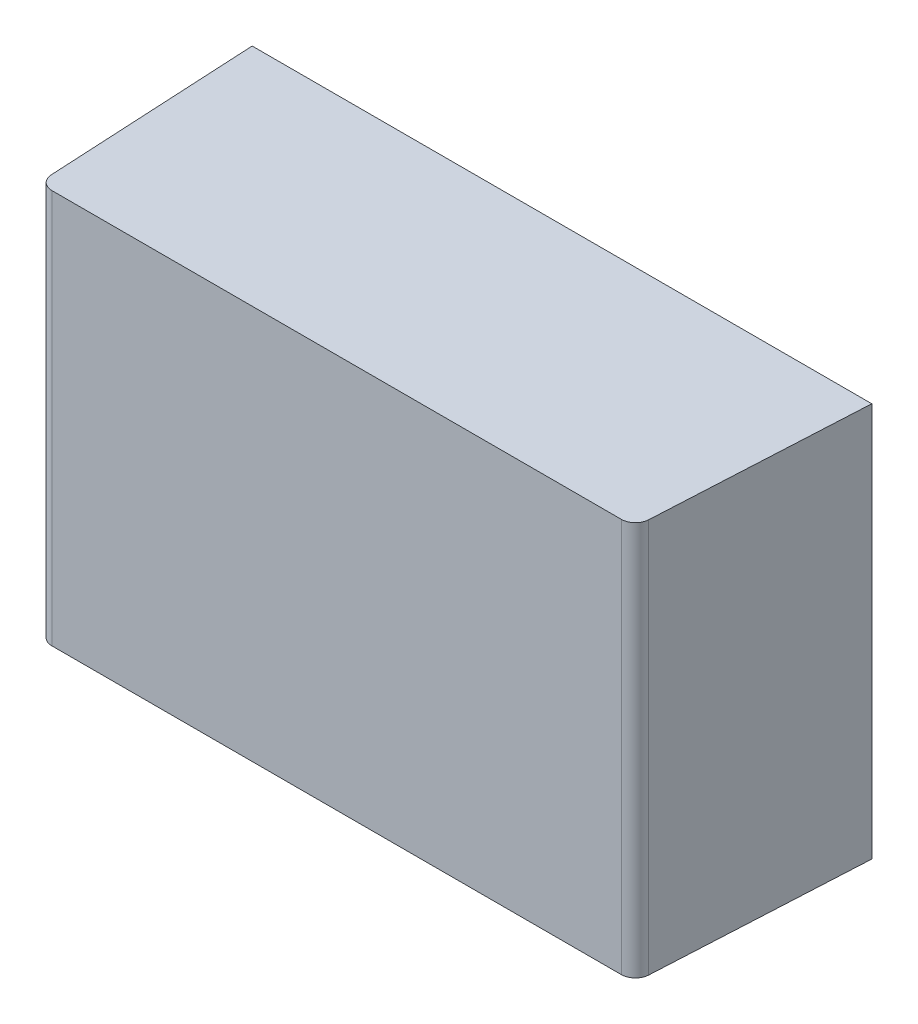
ISO-10303-21;
HEADER;
FILE_DESCRIPTION(('STEP AP214'),'2;1');
FILE_NAME('part.step','',(''),(''),'','','');
FILE_SCHEMA(('AUTOMOTIVE_DESIGN { 1 0 10303 214 1 1 1 1 }'));
ENDSEC;
DATA;
#1=APPLICATION_CONTEXT('core data for automotive mechanical design processes');
#2=APPLICATION_PROTOCOL_DEFINITION('international standard','automotive_design',2000,#1);
#3=PRODUCT_CONTEXT('',#1,'mechanical');
#4=PRODUCT('Part','Part','',(#3));
#5=PRODUCT_RELATED_PRODUCT_CATEGORY('part','',(#4));
#6=PRODUCT_DEFINITION_FORMATION('','',#4);
#7=PRODUCT_DEFINITION_CONTEXT('part definition',#1,'design');
#8=PRODUCT_DEFINITION('design','',#6,#7);
#9=PRODUCT_DEFINITION_SHAPE('','',#8);
#10=(LENGTH_UNIT() NAMED_UNIT(*) SI_UNIT(.MILLI.,.METRE.));
#11=(NAMED_UNIT(*) PLANE_ANGLE_UNIT() SI_UNIT($,.RADIAN.));
#12=(NAMED_UNIT(*) SI_UNIT($,.STERADIAN.) SOLID_ANGLE_UNIT());
#13=UNCERTAINTY_MEASURE_WITH_UNIT(LENGTH_MEASURE(1.E-05),#10,'distance_accuracy_value','');
#14=(GEOMETRIC_REPRESENTATION_CONTEXT(3) GLOBAL_UNCERTAINTY_ASSIGNED_CONTEXT((#13)) GLOBAL_UNIT_ASSIGNED_CONTEXT((#10,
#11,#12)) REPRESENTATION_CONTEXT('',''));
#15=CARTESIAN_POINT('',(0.,0.,0.));
#16=DIRECTION('',(0.,0.,1.));
#17=DIRECTION('',(1.,0.,0.));
#18=AXIS2_PLACEMENT_3D('',#15,#16,#17);
#19=CARTESIAN_POINT('',(-0.505312774119,0.175,0.675));
#20=DIRECTION('',(0.,-1.,0.));
#21=DIRECTION('',(-0.688354575694027,0.,0.725374371012028));
#22=AXIS2_PLACEMENT_3D('',#19,#20,#21);
#23=CYLINDRICAL_SURFACE('',#22,0.025);
#24=CARTESIAN_POINT('',(-0.505312774119,-0.35,0.675));
#25=DIRECTION('',(0.,1.,0.));
#26=DIRECTION('',(-0.688354575694027,0.,0.725374371012028));
#27=AXIS2_PLACEMENT_3D('',#24,#25,#26);
#28=CIRCLE('',#27,0.025);
#29=CARTESIAN_POINT('',(-0.530278512488,-0.35,0.676308398906));
#30=VERTEX_POINT('',#29);
#31=CARTESIAN_POINT('',(-0.505312774119,-0.35,0.7));
#32=VERTEX_POINT('',#31);
#33=EDGE_CURVE('E180',#30,#32,#28,.T.);
#34=ORIENTED_EDGE('',*,*,#33,.T.);
#35=DIRECTION('',(0.,1.,0.));
#36=VECTOR('',#35,1.);
#37=CARTESIAN_POINT('',(-0.505312774119,0.175,0.7));
#38=LINE('',#37,#36);
#39=CARTESIAN_POINT('',(-0.505312774119,0.35,0.7));
#40=VERTEX_POINT('',#39);
#41=EDGE_CURVE('E170',#32,#40,#38,.T.);
#42=ORIENTED_EDGE('',*,*,#41,.T.);
#43=CARTESIAN_POINT('',(-0.505312774119,0.35,0.675));
#44=DIRECTION('',(0.,-1.,0.));
#45=DIRECTION('',(-0.688354575694027,0.,0.725374371012028));
#46=AXIS2_PLACEMENT_3D('',#43,#44,#45);
#47=CIRCLE('',#46,0.025);
#48=CARTESIAN_POINT('',(-0.530278512488,0.35,0.676308398906));
#49=VERTEX_POINT('',#48);
#50=EDGE_CURVE('E11',#40,#49,#47,.T.);
#51=ORIENTED_EDGE('',*,*,#50,.T.);
#52=DIRECTION('',(0.,-1.,0.));
#53=VECTOR('',#52,1.);
#54=CARTESIAN_POINT('',(-0.530278512488,0.175,0.676308398906));
#55=LINE('',#54,#53);
#56=EDGE_CURVE('E140',#49,#30,#55,.T.);
#57=ORIENTED_EDGE('',*,*,#56,.T.);
#58=EDGE_LOOP('',(#34,#42,#51,#57));
#59=FACE_BOUND('',#58,.T.);
#60=ADVANCED_FACE('F17',(#59),#23,.T.);
#61=CARTESIAN_POINT('',(0.55,0.35,0.3));
#62=DIRECTION('',(0.,1.,0.));
#63=DIRECTION('',(1.,0.,0.));
#64=AXIS2_PLACEMENT_3D('',#61,#62,#63);
#65=PLANE('',#64);
#66=ORIENTED_EDGE('',*,*,#50,.F.);
#67=DIRECTION('',(-1.,0.,0.));
#68=VECTOR('',#67,1.);
#69=CARTESIAN_POINT('',(-0.55,0.35,0.7));
#70=LINE('',#69,#68);
#71=CARTESIAN_POINT('',(0.505312774119,0.35,0.7));
#72=VERTEX_POINT('',#71);
#73=EDGE_CURVE('E28',#72,#40,#70,.T.);
#74=ORIENTED_EDGE('',*,*,#73,.F.);
#75=CARTESIAN_POINT('',(0.505312774119,0.35,0.675));
#76=DIRECTION('',(0.,-1.,0.));
#77=DIRECTION('',(0.688354575694027,0.,0.725374371012028));
#78=AXIS2_PLACEMENT_3D('',#75,#76,#77);
#79=CIRCLE('',#78,0.025);
#80=CARTESIAN_POINT('',(0.530278512488,0.35,0.676308398906));
#81=VERTEX_POINT('',#80);
#82=EDGE_CURVE('E172',#81,#72,#79,.T.);
#83=ORIENTED_EDGE('',*,*,#82,.F.);
#84=DIRECTION('',(-0.0523359562429177,0.,0.998629534754575));
#85=VECTOR('',#84,1.);
#86=CARTESIAN_POINT('',(0.55,0.35,0.3));
#87=LINE('',#86,#85);
#88=CARTESIAN_POINT('',(0.55,0.35,0.3));
#89=VERTEX_POINT('',#88);
#90=EDGE_CURVE('E149',#89,#81,#87,.T.);
#91=ORIENTED_EDGE('',*,*,#90,.F.);
#92=DIRECTION('',(-1.,0.,0.));
#93=VECTOR('',#92,1.);
#94=CARTESIAN_POINT('',(-0.55,0.35,0.3));
#95=LINE('',#94,#93);
#96=CARTESIAN_POINT('',(-0.55,0.35,0.3));
#97=VERTEX_POINT('',#96);
#98=EDGE_CURVE('E145',#89,#97,#95,.T.);
#99=ORIENTED_EDGE('',*,*,#98,.T.);
#100=DIRECTION('',(0.0523359562429177,0.,0.998629534754575));
#101=VECTOR('',#100,1.);
#102=CARTESIAN_POINT('',(-0.548493521226,0.35,0.328745327399));
#103=LINE('',#102,#101);
#104=EDGE_CURVE('E133',#97,#49,#103,.T.);
#105=ORIENTED_EDGE('',*,*,#104,.T.);
#106=EDGE_LOOP('',(#66,#74,#83,#91,#99,#105));
#107=FACE_BOUND('',#106,.T.);
#108=ADVANCED_FACE('F146',(#107),#65,.T.);
#109=CARTESIAN_POINT('',(0.,0.,0.7));
#110=DIRECTION('',(0.,0.,1.));
#111=DIRECTION('',(1.,0.,0.));
#112=AXIS2_PLACEMENT_3D('',#109,#110,#111);
#113=PLANE('',#112);
#114=ORIENTED_EDGE('',*,*,#41,.F.);
#115=DIRECTION('',(1.,0.,0.));
#116=VECTOR('',#115,1.);
#117=CARTESIAN_POINT('',(0.55,-0.35,0.7));
#118=LINE('',#117,#116);
#119=CARTESIAN_POINT('',(0.505312774119,-0.35,0.7));
#120=VERTEX_POINT('',#119);
#121=EDGE_CURVE('E216',#32,#120,#118,.T.);
#122=ORIENTED_EDGE('',*,*,#121,.T.);
#123=DIRECTION('',(0.,-1.,0.));
#124=VECTOR('',#123,1.);
#125=CARTESIAN_POINT('',(0.505312774119,-0.175,0.7));
#126=LINE('',#125,#124);
#127=EDGE_CURVE('E176',#72,#120,#126,.T.);
#128=ORIENTED_EDGE('',*,*,#127,.F.);
#129=ORIENTED_EDGE('',*,*,#73,.T.);
#130=EDGE_LOOP('',(#114,#122,#128,#129));
#131=FACE_BOUND('',#130,.T.);
#132=ADVANCED_FACE('F280',(#131),#113,.T.);
#133=CARTESIAN_POINT('',(0.505312774119,-0.175,0.675));
#134=DIRECTION('',(0.,1.,0.));
#135=DIRECTION('',(0.688354575694027,0.,0.725374371012028));
#136=AXIS2_PLACEMENT_3D('',#133,#134,#135);
#137=CYLINDRICAL_SURFACE('',#136,0.025);
#138=ORIENTED_EDGE('',*,*,#82,.T.);
#139=ORIENTED_EDGE('',*,*,#127,.T.);
#140=CARTESIAN_POINT('',(0.505312774119,-0.35,0.675));
#141=DIRECTION('',(0.,1.,0.));
#142=DIRECTION('',(0.688354575694027,0.,0.725374371012028));
#143=AXIS2_PLACEMENT_3D('',#140,#141,#142);
#144=CIRCLE('',#143,0.025);
#145=CARTESIAN_POINT('',(0.530278512488,-0.35,0.676308398906));
#146=VERTEX_POINT('',#145);
#147=EDGE_CURVE('E223',#120,#146,#144,.T.);
#148=ORIENTED_EDGE('',*,*,#147,.T.);
#149=DIRECTION('',(0.,1.,0.));
#150=VECTOR('',#149,1.);
#151=CARTESIAN_POINT('',(0.530278512488,-0.175,0.676308398906));
#152=LINE('',#151,#150);
#153=EDGE_CURVE('E212',#146,#81,#152,.T.);
#154=ORIENTED_EDGE('',*,*,#153,.T.);
#155=EDGE_LOOP('',(#138,#139,#148,#154));
#156=FACE_BOUND('',#155,.T.);
#157=ADVANCED_FACE('F293',(#156),#137,.T.);
#158=CARTESIAN_POINT('',(-0.39,0.35,0.3));
#159=DIRECTION('',(-1.,0.,0.));
#160=DIRECTION('',(0.,0.,1.));
#161=AXIS2_PLACEMENT_3D('',#158,#159,#160);
#162=PLANE('',#161);
#163=DIRECTION('',(0.,-1.,0.));
#164=VECTOR('',#163,1.);
#165=CARTESIAN_POINT('',(-0.39,0.175,0.3));
#166=LINE('',#165,#164);
#167=CARTESIAN_POINT('',(-0.39,0.19,0.3));
#168=VERTEX_POINT('',#167);
#169=CARTESIAN_POINT('',(-0.39,-0.19,0.3));
#170=VERTEX_POINT('',#169);
#171=EDGE_CURVE('E245',#168,#170,#166,.T.);
#172=ORIENTED_EDGE('',*,*,#171,.F.);
#173=DIRECTION('',(0.,0.,1.));
#174=VECTOR('',#173,1.);
#175=CARTESIAN_POINT('',(-0.39,0.19,0.3));
#176=LINE('',#175,#174);
#177=CARTESIAN_POINT('',(-0.39,0.19,0.54));
#178=VERTEX_POINT('',#177);
#179=EDGE_CURVE('E74',#168,#178,#176,.T.);
#180=ORIENTED_EDGE('',*,*,#179,.T.);
#181=DIRECTION('',(0.,-1.,0.));
#182=VECTOR('',#181,1.);
#183=CARTESIAN_POINT('',(-0.39,0.175,0.54));
#184=LINE('',#183,#182);
#185=CARTESIAN_POINT('',(-0.39,-0.19,0.54));
#186=VERTEX_POINT('',#185);
#187=EDGE_CURVE('E198',#178,#186,#184,.T.);
#188=ORIENTED_EDGE('',*,*,#187,.T.);
#189=DIRECTION('',(0.,0.,1.));
#190=VECTOR('',#189,1.);
#191=CARTESIAN_POINT('',(-0.39,-0.19,0.3));
#192=LINE('',#191,#190);
#193=EDGE_CURVE('E58',#170,#186,#192,.T.);
#194=ORIENTED_EDGE('',*,*,#193,.F.);
#195=EDGE_LOOP('',(#172,#180,#188,#194));
#196=FACE_BOUND('',#195,.T.);
#197=ADVANCED_FACE('F259',(#196),#162,.F.);
#198=CARTESIAN_POINT('',(0.55,0.19,0.3));
#199=DIRECTION('',(0.,1.,0.));
#200=DIRECTION('',(1.,0.,0.));
#201=AXIS2_PLACEMENT_3D('',#198,#199,#200);
#202=PLANE('',#201);
#203=DIRECTION('',(-1.,0.,0.));
#204=VECTOR('',#203,1.);
#205=CARTESIAN_POINT('',(0.275,0.19,0.3));
#206=LINE('',#205,#204);
#207=CARTESIAN_POINT('',(0.39,0.19,0.3));
#208=VERTEX_POINT('',#207);
#209=EDGE_CURVE('E166',#208,#168,#206,.T.);
#210=ORIENTED_EDGE('',*,*,#209,.F.);
#211=DIRECTION('',(0.,0.,1.));
#212=VECTOR('',#211,1.);
#213=CARTESIAN_POINT('',(0.39,0.19,0.3));
#214=LINE('',#213,#212);
#215=CARTESIAN_POINT('',(0.39,0.19,0.54));
#216=VERTEX_POINT('',#215);
#217=EDGE_CURVE('E21',#208,#216,#214,.T.);
#218=ORIENTED_EDGE('',*,*,#217,.T.);
#219=DIRECTION('',(-1.,0.,0.));
#220=VECTOR('',#219,1.);
#221=CARTESIAN_POINT('',(0.275,0.19,0.54));
#222=LINE('',#221,#220);
#223=EDGE_CURVE('E203',#216,#178,#222,.T.);
#224=ORIENTED_EDGE('',*,*,#223,.T.);
#225=ORIENTED_EDGE('',*,*,#179,.F.);
#226=EDGE_LOOP('',(#210,#218,#224,#225));
#227=FACE_BOUND('',#226,.T.);
#228=ADVANCED_FACE('F258',(#227),#202,.F.);
#229=CARTESIAN_POINT('',(0.39,-0.35,0.3));
#230=DIRECTION('',(1.,0.,0.));
#231=DIRECTION('',(0.,1.,0.));
#232=AXIS2_PLACEMENT_3D('',#229,#230,#231);
#233=PLANE('',#232);
#234=DIRECTION('',(0.,1.,0.));
#235=VECTOR('',#234,1.);
#236=CARTESIAN_POINT('',(0.39,-0.175,0.3));
#237=LINE('',#236,#235);
#238=CARTESIAN_POINT('',(0.39,-0.19,0.3));
#239=VERTEX_POINT('',#238);
#240=EDGE_CURVE('E229',#239,#208,#237,.T.);
#241=ORIENTED_EDGE('',*,*,#240,.F.);
#242=DIRECTION('',(0.,0.,1.));
#243=VECTOR('',#242,1.);
#244=CARTESIAN_POINT('',(0.39,-0.19,0.3));
#245=LINE('',#244,#243);
#246=CARTESIAN_POINT('',(0.39,-0.19,0.54));
#247=VERTEX_POINT('',#246);
#248=EDGE_CURVE('E111',#239,#247,#245,.T.);
#249=ORIENTED_EDGE('',*,*,#248,.T.);
#250=DIRECTION('',(0.,1.,0.));
#251=VECTOR('',#250,1.);
#252=CARTESIAN_POINT('',(0.39,-0.175,0.54));
#253=LINE('',#252,#251);
#254=EDGE_CURVE('E178',#247,#216,#253,.T.);
#255=ORIENTED_EDGE('',*,*,#254,.T.);
#256=ORIENTED_EDGE('',*,*,#217,.F.);
#257=EDGE_LOOP('',(#241,#249,#255,#256));
#258=FACE_BOUND('',#257,.T.);
#259=ADVANCED_FACE('F255',(#258),#233,.F.);
#260=CARTESIAN_POINT('',(-0.55,-0.19,0.3));
#261=DIRECTION('',(0.,-1.,0.));
#262=DIRECTION('',(0.,0.,-1.));
#263=AXIS2_PLACEMENT_3D('',#260,#261,#262);
#264=PLANE('',#263);
#265=DIRECTION('',(1.,0.,0.));
#266=VECTOR('',#265,1.);
#267=CARTESIAN_POINT('',(-0.275,-0.19,0.3));
#268=LINE('',#267,#266);
#269=EDGE_CURVE('E232',#170,#239,#268,.T.);
#270=ORIENTED_EDGE('',*,*,#269,.F.);
#271=ORIENTED_EDGE('',*,*,#193,.T.);
#272=DIRECTION('',(1.,0.,0.));
#273=VECTOR('',#272,1.);
#274=CARTESIAN_POINT('',(-0.275,-0.19,0.54));
#275=LINE('',#274,#273);
#276=EDGE_CURVE('E142',#186,#247,#275,.T.);
#277=ORIENTED_EDGE('',*,*,#276,.T.);
#278=ORIENTED_EDGE('',*,*,#248,.F.);
#279=EDGE_LOOP('',(#270,#271,#277,#278));
#280=FACE_BOUND('',#279,.T.);
#281=ADVANCED_FACE('F254',(#280),#264,.F.);
#282=CARTESIAN_POINT('',(0.,0.,0.54));
#283=DIRECTION('',(0.,0.,1.));
#284=DIRECTION('',(1.,0.,0.));
#285=AXIS2_PLACEMENT_3D('',#282,#283,#284);
#286=PLANE('',#285);
#287=ORIENTED_EDGE('',*,*,#276,.F.);
#288=ORIENTED_EDGE('',*,*,#187,.F.);
#289=ORIENTED_EDGE('',*,*,#223,.F.);
#290=ORIENTED_EDGE('',*,*,#254,.F.);
#291=EDGE_LOOP('',(#287,#288,#289,#290));
#292=FACE_BOUND('',#291,.T.);
#293=ADVANCED_FACE('F261',(#292),#286,.F.);
#294=CARTESIAN_POINT('',(-0.55,0.35,0.3));
#295=DIRECTION('',(-0.998629534754575,0.,0.0523359562429177));
#296=DIRECTION('',(0.,1.,0.));
#297=AXIS2_PLACEMENT_3D('',#294,#295,#296);
#298=PLANE('',#297);
#299=ORIENTED_EDGE('',*,*,#56,.F.);
#300=ORIENTED_EDGE('',*,*,#104,.F.);
#301=DIRECTION('',(0.,-1.,0.));
#302=VECTOR('',#301,1.);
#303=CARTESIAN_POINT('',(-0.55,-0.35,0.3));
#304=LINE('',#303,#302);
#305=CARTESIAN_POINT('',(-0.55,-0.35,0.3));
#306=VERTEX_POINT('',#305);
#307=EDGE_CURVE('E138',#97,#306,#304,.T.);
#308=ORIENTED_EDGE('',*,*,#307,.T.);
#309=DIRECTION('',(0.0523359562429177,0.,0.998629534754575));
#310=VECTOR('',#309,1.);
#311=CARTESIAN_POINT('',(-0.55,-0.35,0.3));
#312=LINE('',#311,#310);
#313=EDGE_CURVE('E186',#306,#30,#312,.T.);
#314=ORIENTED_EDGE('',*,*,#313,.T.);
#315=EDGE_LOOP('',(#299,#300,#308,#314));
#316=FACE_BOUND('',#315,.T.);
#317=ADVANCED_FACE('F135',(#316),#298,.T.);
#318=CARTESIAN_POINT('',(0.55,-0.35,0.3));
#319=DIRECTION('',(0.998629534754575,0.,0.0523359562429177));
#320=DIRECTION('',(0.,-1.,0.));
#321=AXIS2_PLACEMENT_3D('',#318,#319,#320);
#322=PLANE('',#321);
#323=ORIENTED_EDGE('',*,*,#153,.F.);
#324=DIRECTION('',(-0.0523359562429177,0.,0.998629534754575));
#325=VECTOR('',#324,1.);
#326=CARTESIAN_POINT('',(0.548493521226,-0.35,0.328745327399));
#327=LINE('',#326,#325);
#328=CARTESIAN_POINT('',(0.55,-0.35,0.3));
#329=VERTEX_POINT('',#328);
#330=EDGE_CURVE('E194',#329,#146,#327,.T.);
#331=ORIENTED_EDGE('',*,*,#330,.F.);
#332=DIRECTION('',(0.,1.,0.));
#333=VECTOR('',#332,1.);
#334=CARTESIAN_POINT('',(0.55,0.35,0.3));
#335=LINE('',#334,#333);
#336=EDGE_CURVE('E154',#329,#89,#335,.T.);
#337=ORIENTED_EDGE('',*,*,#336,.T.);
#338=ORIENTED_EDGE('',*,*,#90,.T.);
#339=EDGE_LOOP('',(#323,#331,#337,#338));
#340=FACE_BOUND('',#339,.T.);
#341=ADVANCED_FACE('F19',(#340),#322,.T.);
#342=CARTESIAN_POINT('',(-0.55,-0.35,0.3));
#343=DIRECTION('',(0.,-1.,0.));
#344=DIRECTION('',(0.,0.,-1.));
#345=AXIS2_PLACEMENT_3D('',#342,#343,#344);
#346=PLANE('',#345);
#347=ORIENTED_EDGE('',*,*,#33,.F.);
#348=ORIENTED_EDGE('',*,*,#313,.F.);
#349=DIRECTION('',(1.,0.,0.));
#350=VECTOR('',#349,1.);
#351=CARTESIAN_POINT('',(0.55,-0.35,0.3));
#352=LINE('',#351,#350);
#353=EDGE_CURVE('E159',#306,#329,#352,.T.);
#354=ORIENTED_EDGE('',*,*,#353,.T.);
#355=ORIENTED_EDGE('',*,*,#330,.T.);
#356=ORIENTED_EDGE('',*,*,#147,.F.);
#357=ORIENTED_EDGE('',*,*,#121,.F.);
#358=EDGE_LOOP('',(#347,#348,#354,#355,#356,#357));
#359=FACE_BOUND('',#358,.T.);
#360=ADVANCED_FACE('F285',(#359),#346,.T.);
#361=CARTESIAN_POINT('',(0.,0.,0.3));
#362=DIRECTION('',(0.,0.,1.));
#363=DIRECTION('',(1.,0.,0.));
#364=AXIS2_PLACEMENT_3D('',#361,#362,#363);
#365=PLANE('',#364);
#366=ORIENTED_EDGE('',*,*,#353,.F.);
#367=ORIENTED_EDGE('',*,*,#307,.F.);
#368=ORIENTED_EDGE('',*,*,#98,.F.);
#369=ORIENTED_EDGE('',*,*,#336,.F.);
#370=EDGE_LOOP('',(#366,#367,#368,#369));
#371=FACE_BOUND('',#370,.T.);
#372=ORIENTED_EDGE('',*,*,#171,.T.);
#373=ORIENTED_EDGE('',*,*,#269,.T.);
#374=ORIENTED_EDGE('',*,*,#240,.T.);
#375=ORIENTED_EDGE('',*,*,#209,.T.);
#376=EDGE_LOOP('',(#372,#373,#374,#375));
#377=FACE_BOUND('',#376,.T.);
#378=ADVANCED_FACE('F156',(#371,#377),#365,.F.);
#379=CLOSED_SHELL('',(#60,#108,#132,#157,#197,#228,#259,#281,#293,#317,#341,#360,#378));
#380=MANIFOLD_SOLID_BREP('B1',#379);
#381=ADVANCED_BREP_SHAPE_REPRESENTATION('',(#18,#380),#14);
#382=SHAPE_DEFINITION_REPRESENTATION(#9,#381);
ENDSEC;
END-ISO-10303-21;
